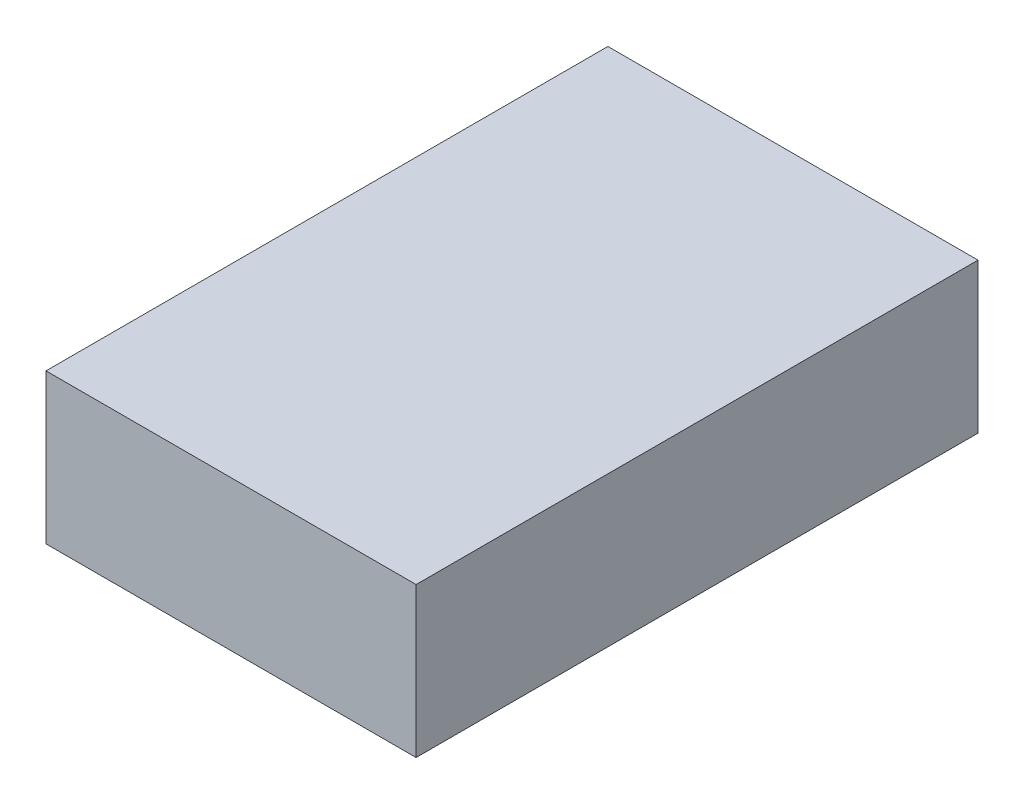
ISO-10303-21;
HEADER;
FILE_DESCRIPTION(('STEP AP214'),'2;1');
FILE_NAME('part.step','',(''),(''),'','','');
FILE_SCHEMA(('AUTOMOTIVE_DESIGN { 1 0 10303 214 1 1 1 1 }'));
ENDSEC;
DATA;
#1=APPLICATION_CONTEXT('core data for automotive mechanical design processes');
#2=APPLICATION_PROTOCOL_DEFINITION('international standard','automotive_design',2000,#1);
#3=PRODUCT_CONTEXT('',#1,'mechanical');
#4=PRODUCT('Part','Part','',(#3));
#5=PRODUCT_RELATED_PRODUCT_CATEGORY('part','',(#4));
#6=PRODUCT_DEFINITION_FORMATION('','',#4);
#7=PRODUCT_DEFINITION_CONTEXT('part definition',#1,'design');
#8=PRODUCT_DEFINITION('design','',#6,#7);
#9=PRODUCT_DEFINITION_SHAPE('','',#8);
#10=(LENGTH_UNIT() NAMED_UNIT(*) SI_UNIT(.MILLI.,.METRE.));
#11=(NAMED_UNIT(*) PLANE_ANGLE_UNIT() SI_UNIT($,.RADIAN.));
#12=(NAMED_UNIT(*) SI_UNIT($,.STERADIAN.) SOLID_ANGLE_UNIT());
#13=UNCERTAINTY_MEASURE_WITH_UNIT(LENGTH_MEASURE(1.E-05),#10,'distance_accuracy_value','');
#14=(GEOMETRIC_REPRESENTATION_CONTEXT(3) GLOBAL_UNCERTAINTY_ASSIGNED_CONTEXT((#13)) GLOBAL_UNIT_ASSIGNED_CONTEXT((#10,
#11,#12)) REPRESENTATION_CONTEXT('',''));
#15=CARTESIAN_POINT('',(0.,0.,0.));
#16=DIRECTION('',(0.,0.,1.));
#17=DIRECTION('',(1.,0.,0.));
#18=AXIS2_PLACEMENT_3D('',#15,#16,#17);
#19=CARTESIAN_POINT('',(0.,2.,-15.));
#20=DIRECTION('',(1.,0.,0.));
#21=DIRECTION('',(0.,0.,-1.));
#22=AXIS2_PLACEMENT_3D('',#19,#20,#21);
#23=PLANE('',#22);
#24=DIRECTION('',(0.,0.,1.));
#25=VECTOR('',#24,1.);
#26=CARTESIAN_POINT('',(0.,-2.,-15.));
#27=LINE('',#26,#25);
#28=CARTESIAN_POINT('',(0.,-2.,-15.));
#29=VERTEX_POINT('',#28);
#30=CARTESIAN_POINT('',(0.,-2.,0.));
#31=VERTEX_POINT('',#30);
#32=EDGE_CURVE('E100',#29,#31,#27,.T.);
#33=ORIENTED_EDGE('',*,*,#32,.T.);
#34=DIRECTION('',(0.,-1.,0.));
#35=VECTOR('',#34,1.);
#36=CARTESIAN_POINT('',(0.,2.,0.));
#37=LINE('',#36,#35);
#38=CARTESIAN_POINT('',(0.,2.,0.));
#39=VERTEX_POINT('',#38);
#40=EDGE_CURVE('E11',#39,#31,#37,.T.);
#41=ORIENTED_EDGE('',*,*,#40,.F.);
#42=DIRECTION('',(0.,0.,1.));
#43=VECTOR('',#42,1.);
#44=CARTESIAN_POINT('',(0.,2.,-15.));
#45=LINE('',#44,#43);
#46=CARTESIAN_POINT('',(0.,2.,-15.));
#47=VERTEX_POINT('',#46);
#48=EDGE_CURVE('E88',#47,#39,#45,.T.);
#49=ORIENTED_EDGE('',*,*,#48,.F.);
#50=DIRECTION('',(0.,-1.,0.));
#51=VECTOR('',#50,1.);
#52=CARTESIAN_POINT('',(0.,2.,-15.));
#53=LINE('',#52,#51);
#54=EDGE_CURVE('E96',#47,#29,#53,.T.);
#55=ORIENTED_EDGE('',*,*,#54,.T.);
#56=EDGE_LOOP('',(#33,#41,#49,#55));
#57=FACE_BOUND('',#56,.T.);
#58=ADVANCED_FACE('F37',(#57),#23,.F.);
#59=CARTESIAN_POINT('',(0.,2.,0.));
#60=DIRECTION('',(0.,0.,-1.));
#61=DIRECTION('',(-1.,0.,0.));
#62=AXIS2_PLACEMENT_3D('',#59,#60,#61);
#63=PLANE('',#62);
#64=DIRECTION('',(1.,0.,0.));
#65=VECTOR('',#64,1.);
#66=CARTESIAN_POINT('',(0.,-2.,0.));
#67=LINE('',#66,#65);
#68=CARTESIAN_POINT('',(9.88,-2.,0.));
#69=VERTEX_POINT('',#68);
#70=EDGE_CURVE('E92',#31,#69,#67,.T.);
#71=ORIENTED_EDGE('',*,*,#70,.T.);
#72=DIRECTION('',(0.,-1.,0.));
#73=VECTOR('',#72,1.);
#74=CARTESIAN_POINT('',(9.88,2.,0.));
#75=LINE('',#74,#73);
#76=CARTESIAN_POINT('',(9.88,2.,0.));
#77=VERTEX_POINT('',#76);
#78=EDGE_CURVE('E45',#77,#69,#75,.T.);
#79=ORIENTED_EDGE('',*,*,#78,.F.);
#80=DIRECTION('',(1.,0.,0.));
#81=VECTOR('',#80,1.);
#82=CARTESIAN_POINT('',(0.,2.,0.));
#83=LINE('',#82,#81);
#84=EDGE_CURVE('E83',#39,#77,#83,.T.);
#85=ORIENTED_EDGE('',*,*,#84,.F.);
#86=ORIENTED_EDGE('',*,*,#40,.T.);
#87=EDGE_LOOP('',(#71,#79,#85,#86));
#88=FACE_BOUND('',#87,.T.);
#89=ADVANCED_FACE('F91',(#88),#63,.F.);
#90=CARTESIAN_POINT('',(9.88,2.,-15.));
#91=DIRECTION('',(-1.,0.,0.));
#92=DIRECTION('',(0.,0.,1.));
#93=AXIS2_PLACEMENT_3D('',#90,#91,#92);
#94=PLANE('',#93);
#95=DIRECTION('',(0.,0.,-1.));
#96=VECTOR('',#95,1.);
#97=CARTESIAN_POINT('',(9.88,-2.,-15.));
#98=LINE('',#97,#96);
#99=CARTESIAN_POINT('',(9.88,-2.,-15.));
#100=VERTEX_POINT('',#99);
#101=EDGE_CURVE('E70',#69,#100,#98,.T.);
#102=ORIENTED_EDGE('',*,*,#101,.T.);
#103=DIRECTION('',(0.,-1.,0.));
#104=VECTOR('',#103,1.);
#105=CARTESIAN_POINT('',(9.88,2.,-15.));
#106=LINE('',#105,#104);
#107=CARTESIAN_POINT('',(9.88,2.,-15.));
#108=VERTEX_POINT('',#107);
#109=EDGE_CURVE('E93',#108,#100,#106,.T.);
#110=ORIENTED_EDGE('',*,*,#109,.F.);
#111=DIRECTION('',(0.,0.,-1.));
#112=VECTOR('',#111,1.);
#113=CARTESIAN_POINT('',(9.88,2.,-15.));
#114=LINE('',#113,#112);
#115=EDGE_CURVE('E86',#77,#108,#114,.T.);
#116=ORIENTED_EDGE('',*,*,#115,.F.);
#117=ORIENTED_EDGE('',*,*,#78,.T.);
#118=EDGE_LOOP('',(#102,#110,#116,#117));
#119=FACE_BOUND('',#118,.T.);
#120=ADVANCED_FACE('F94',(#119),#94,.F.);
#121=CARTESIAN_POINT('',(0.,2.,-15.));
#122=DIRECTION('',(0.,0.,1.));
#123=DIRECTION('',(1.,0.,0.));
#124=AXIS2_PLACEMENT_3D('',#121,#122,#123);
#125=PLANE('',#124);
#126=DIRECTION('',(-1.,0.,0.));
#127=VECTOR('',#126,1.);
#128=CARTESIAN_POINT('',(0.,-2.,-15.));
#129=LINE('',#128,#127);
#130=EDGE_CURVE('E76',#100,#29,#129,.T.);
#131=ORIENTED_EDGE('',*,*,#130,.T.);
#132=ORIENTED_EDGE('',*,*,#54,.F.);
#133=DIRECTION('',(-1.,0.,0.));
#134=VECTOR('',#133,1.);
#135=CARTESIAN_POINT('',(0.,2.,-15.));
#136=LINE('',#135,#134);
#137=EDGE_CURVE('E53',#108,#47,#136,.T.);
#138=ORIENTED_EDGE('',*,*,#137,.F.);
#139=ORIENTED_EDGE('',*,*,#109,.T.);
#140=EDGE_LOOP('',(#131,#132,#138,#139));
#141=FACE_BOUND('',#140,.T.);
#142=ADVANCED_FACE('F107',(#141),#125,.F.);
#143=CARTESIAN_POINT('',(0.,2.,0.));
#144=DIRECTION('',(0.,1.,0.));
#145=DIRECTION('',(0.,0.,1.));
#146=AXIS2_PLACEMENT_3D('',#143,#144,#145);
#147=PLANE('',#146);
#148=ORIENTED_EDGE('',*,*,#48,.T.);
#149=ORIENTED_EDGE('',*,*,#84,.T.);
#150=ORIENTED_EDGE('',*,*,#115,.T.);
#151=ORIENTED_EDGE('',*,*,#137,.T.);
#152=EDGE_LOOP('',(#148,#149,#150,#151));
#153=FACE_BOUND('',#152,.T.);
#154=ADVANCED_FACE('F84',(#153),#147,.T.);
#155=CARTESIAN_POINT('',(0.,-2.,0.));
#156=DIRECTION('',(0.,1.,0.));
#157=DIRECTION('',(0.,0.,1.));
#158=AXIS2_PLACEMENT_3D('',#155,#156,#157);
#159=PLANE('',#158);
#160=ORIENTED_EDGE('',*,*,#32,.F.);
#161=ORIENTED_EDGE('',*,*,#130,.F.);
#162=ORIENTED_EDGE('',*,*,#101,.F.);
#163=ORIENTED_EDGE('',*,*,#70,.F.);
#164=EDGE_LOOP('',(#160,#161,#162,#163));
#165=FACE_BOUND('',#164,.T.);
#166=ADVANCED_FACE('F110',(#165),#159,.F.);
#167=CLOSED_SHELL('',(#58,#89,#120,#142,#154,#166));
#168=MANIFOLD_SOLID_BREP('B2',#167);
#169=ADVANCED_BREP_SHAPE_REPRESENTATION('',(#18,#168),#14);
#170=SHAPE_DEFINITION_REPRESENTATION(#9,#169);
ENDSEC;
END-ISO-10303-21;
